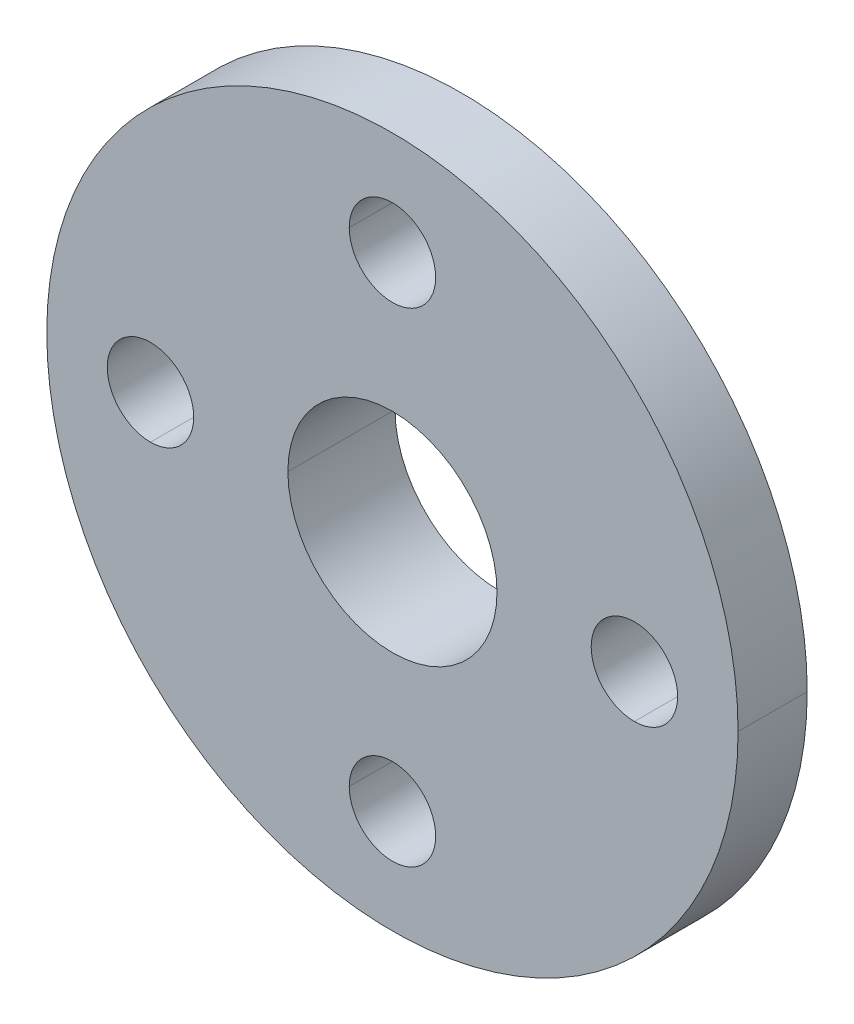
ISO-10303-21;
HEADER;
FILE_DESCRIPTION(('STEP AP214'),'2;1');
FILE_NAME('part.step','',(''),(''),'','','');
FILE_SCHEMA(('AUTOMOTIVE_DESIGN { 1 0 10303 214 1 1 1 1 }'));
ENDSEC;
DATA;
#1=APPLICATION_CONTEXT('core data for automotive mechanical design processes');
#2=APPLICATION_PROTOCOL_DEFINITION('international standard','automotive_design',2000,#1);
#3=PRODUCT_CONTEXT('',#1,'mechanical');
#4=PRODUCT('Part','Part','',(#3));
#5=PRODUCT_RELATED_PRODUCT_CATEGORY('part','',(#4));
#6=PRODUCT_DEFINITION_FORMATION('','',#4);
#7=PRODUCT_DEFINITION_CONTEXT('part definition',#1,'design');
#8=PRODUCT_DEFINITION('design','',#6,#7);
#9=PRODUCT_DEFINITION_SHAPE('','',#8);
#10=(LENGTH_UNIT() NAMED_UNIT(*) SI_UNIT(.MILLI.,.METRE.));
#11=(NAMED_UNIT(*) PLANE_ANGLE_UNIT() SI_UNIT($,.RADIAN.));
#12=(NAMED_UNIT(*) SI_UNIT($,.STERADIAN.) SOLID_ANGLE_UNIT());
#13=UNCERTAINTY_MEASURE_WITH_UNIT(LENGTH_MEASURE(1.E-05),#10,'distance_accuracy_value','');
#14=(GEOMETRIC_REPRESENTATION_CONTEXT(3) GLOBAL_UNCERTAINTY_ASSIGNED_CONTEXT((#13)) GLOBAL_UNIT_ASSIGNED_CONTEXT((#10,
#11,#12)) REPRESENTATION_CONTEXT('',''));
#15=CARTESIAN_POINT('',(0.,0.,0.));
#16=DIRECTION('',(0.,0.,1.));
#17=DIRECTION('',(1.,0.,0.));
#18=AXIS2_PLACEMENT_3D('',#15,#16,#17);
#19=CARTESIAN_POINT('',(-46.10264464667,-19.8999981269,11.476));
#20=DIRECTION('',(0.,0.,1.));
#21=DIRECTION('',(0.,1.,0.));
#22=AXIS2_PLACEMENT_3D('',#19,#20,#21);
#23=CYLINDRICAL_SURFACE('',#22,1.25);
#24=DIRECTION('',(0.,0.,1.));
#25=VECTOR('',#24,1.);
#26=CARTESIAN_POINT('',(-46.10264464667,-18.6499981269,9.476));
#27=LINE('',#26,#25);
#28=CARTESIAN_POINT('',(-46.10264464667,-18.6499981269,9.476));
#29=VERTEX_POINT('',#28);
#30=CARTESIAN_POINT('',(-46.10264464667,-18.6499981269,11.476));
#31=VERTEX_POINT('',#30);
#32=EDGE_CURVE('E11',#29,#31,#27,.T.);
#33=ORIENTED_EDGE('',*,*,#32,.F.);
#34=CARTESIAN_POINT('',(-46.10264464667,-19.8999981269,9.476));
#35=DIRECTION('',(0.,0.,-1.));
#36=DIRECTION('',(0.,1.,0.));
#37=AXIS2_PLACEMENT_3D('',#34,#35,#36);
#38=CIRCLE('',#37,1.25);
#39=CARTESIAN_POINT('',(-46.10264464667,-21.1499981269,9.476));
#40=VERTEX_POINT('',#39);
#41=EDGE_CURVE('E217',#29,#40,#38,.T.);
#42=ORIENTED_EDGE('',*,*,#41,.T.);
#43=DIRECTION('',(0.,0.,1.));
#44=VECTOR('',#43,1.);
#45=CARTESIAN_POINT('',(-46.10264464667,-21.1499981269,9.476));
#46=LINE('',#45,#44);
#47=CARTESIAN_POINT('',(-46.10264464667,-21.1499981269,11.476));
#48=VERTEX_POINT('',#47);
#49=EDGE_CURVE('E27',#40,#48,#46,.T.);
#50=ORIENTED_EDGE('',*,*,#49,.T.);
#51=CARTESIAN_POINT('',(-46.10264464667,-19.8999981269,11.476));
#52=DIRECTION('',(0.,0.,1.));
#53=DIRECTION('',(0.,-1.,0.));
#54=AXIS2_PLACEMENT_3D('',#51,#52,#53);
#55=CIRCLE('',#54,1.25);
#56=EDGE_CURVE('E180',#48,#31,#55,.T.);
#57=ORIENTED_EDGE('',*,*,#56,.T.);
#58=EDGE_LOOP('',(#33,#42,#50,#57));
#59=FACE_BOUND('',#58,.T.);
#60=ADVANCED_FACE('F16',(#59),#23,.F.);
#61=CARTESIAN_POINT('',(-46.10264464667,-19.8999981269,11.476));
#62=DIRECTION('',(0.,0.,1.));
#63=DIRECTION('',(0.,1.,0.));
#64=AXIS2_PLACEMENT_3D('',#61,#62,#63);
#65=CYLINDRICAL_SURFACE('',#64,1.25);
#66=ORIENTED_EDGE('',*,*,#49,.F.);
#67=CARTESIAN_POINT('',(-46.10264464667,-19.8999981269,9.476));
#68=DIRECTION('',(0.,0.,-1.));
#69=DIRECTION('',(0.,-1.,0.));
#70=AXIS2_PLACEMENT_3D('',#67,#68,#69);
#71=CIRCLE('',#70,1.25);
#72=EDGE_CURVE('E203',#40,#29,#71,.T.);
#73=ORIENTED_EDGE('',*,*,#72,.T.);
#74=ORIENTED_EDGE('',*,*,#32,.T.);
#75=CARTESIAN_POINT('',(-46.10264464667,-19.8999981269,11.476));
#76=DIRECTION('',(0.,0.,1.));
#77=DIRECTION('',(0.,1.,0.));
#78=AXIS2_PLACEMENT_3D('',#75,#76,#77);
#79=CIRCLE('',#78,1.25);
#80=EDGE_CURVE('E249',#31,#48,#79,.T.);
#81=ORIENTED_EDGE('',*,*,#80,.T.);
#82=EDGE_LOOP('',(#66,#73,#74,#81));
#83=FACE_BOUND('',#82,.T.);
#84=ADVANCED_FACE('F343',(#83),#65,.F.);
#85=CARTESIAN_POINT('',(-39.10264651977,-26.8999962538,11.476));
#86=DIRECTION('',(0.,0.,1.));
#87=DIRECTION('',(-1.,0.,0.));
#88=AXIS2_PLACEMENT_3D('',#85,#86,#87);
#89=CYLINDRICAL_SURFACE('',#88,1.25);
#90=DIRECTION('',(0.,0.,1.));
#91=VECTOR('',#90,1.);
#92=CARTESIAN_POINT('',(-40.35264651977,-26.8999962538,9.476));
#93=LINE('',#92,#91);
#94=CARTESIAN_POINT('',(-40.35264651977,-26.8999962538,9.476));
#95=VERTEX_POINT('',#94);
#96=CARTESIAN_POINT('',(-40.35264651977,-26.8999962538,11.476));
#97=VERTEX_POINT('',#96);
#98=EDGE_CURVE('E195',#95,#97,#93,.T.);
#99=ORIENTED_EDGE('',*,*,#98,.F.);
#100=CARTESIAN_POINT('',(-39.10264651977,-26.8999962538,9.476));
#101=DIRECTION('',(0.,0.,-1.));
#102=DIRECTION('',(-1.,0.,0.));
#103=AXIS2_PLACEMENT_3D('',#100,#101,#102);
#104=CIRCLE('',#103,1.25);
#105=CARTESIAN_POINT('',(-37.85264651977,-26.8999962538,9.476));
#106=VERTEX_POINT('',#105);
#107=EDGE_CURVE('E225',#95,#106,#104,.T.);
#108=ORIENTED_EDGE('',*,*,#107,.T.);
#109=DIRECTION('',(0.,0.,1.));
#110=VECTOR('',#109,1.);
#111=CARTESIAN_POINT('',(-37.85264651977,-26.8999962538,9.476));
#112=LINE('',#111,#110);
#113=CARTESIAN_POINT('',(-37.85264651977,-26.8999962538,11.476));
#114=VERTEX_POINT('',#113);
#115=EDGE_CURVE('E283',#106,#114,#112,.T.);
#116=ORIENTED_EDGE('',*,*,#115,.T.);
#117=CARTESIAN_POINT('',(-39.10264651977,-26.8999962538,11.476));
#118=DIRECTION('',(0.,0.,1.));
#119=DIRECTION('',(1.,0.,0.));
#120=AXIS2_PLACEMENT_3D('',#117,#118,#119);
#121=CIRCLE('',#120,1.25);
#122=EDGE_CURVE('E253',#114,#97,#121,.T.);
#123=ORIENTED_EDGE('',*,*,#122,.T.);
#124=EDGE_LOOP('',(#99,#108,#116,#123));
#125=FACE_BOUND('',#124,.T.);
#126=ADVANCED_FACE('F349',(#125),#89,.F.);
#127=CARTESIAN_POINT('',(-39.10264651977,-26.8999962538,11.476));
#128=DIRECTION('',(0.,0.,1.));
#129=DIRECTION('',(-1.,0.,0.));
#130=AXIS2_PLACEMENT_3D('',#127,#128,#129);
#131=CYLINDRICAL_SURFACE('',#130,1.25);
#132=ORIENTED_EDGE('',*,*,#115,.F.);
#133=CARTESIAN_POINT('',(-39.10264651977,-26.8999962538,9.476));
#134=DIRECTION('',(0.,0.,-1.));
#135=DIRECTION('',(1.,0.,0.));
#136=AXIS2_PLACEMENT_3D('',#133,#134,#135);
#137=CIRCLE('',#136,1.25);
#138=EDGE_CURVE('E221',#106,#95,#137,.T.);
#139=ORIENTED_EDGE('',*,*,#138,.T.);
#140=ORIENTED_EDGE('',*,*,#98,.T.);
#141=CARTESIAN_POINT('',(-39.10264651977,-26.8999962538,11.476));
#142=DIRECTION('',(0.,0.,1.));
#143=DIRECTION('',(-1.,0.,0.));
#144=AXIS2_PLACEMENT_3D('',#141,#142,#143);
#145=CIRCLE('',#144,1.25);
#146=EDGE_CURVE('E267',#97,#114,#145,.T.);
#147=ORIENTED_EDGE('',*,*,#146,.T.);
#148=EDGE_LOOP('',(#132,#139,#140,#147));
#149=FACE_BOUND('',#148,.T.);
#150=ADVANCED_FACE('F368',(#149),#131,.F.);
#151=CARTESIAN_POINT('',(-32.10264839287,-19.8999981269,11.476));
#152=DIRECTION('',(0.,0.,1.));
#153=DIRECTION('',(0.,-1.,0.));
#154=AXIS2_PLACEMENT_3D('',#151,#152,#153);
#155=CYLINDRICAL_SURFACE('',#154,1.25);
#156=DIRECTION('',(0.,0.,1.));
#157=VECTOR('',#156,1.);
#158=CARTESIAN_POINT('',(-32.10264839287,-21.1499981269,9.476));
#159=LINE('',#158,#157);
#160=CARTESIAN_POINT('',(-32.10264839287,-21.1499981269,9.476));
#161=VERTEX_POINT('',#160);
#162=CARTESIAN_POINT('',(-32.10264839287,-21.1499981269,11.476));
#163=VERTEX_POINT('',#162);
#164=EDGE_CURVE('E278',#161,#163,#159,.T.);
#165=ORIENTED_EDGE('',*,*,#164,.F.);
#166=CARTESIAN_POINT('',(-32.10264839287,-19.8999981269,9.476));
#167=DIRECTION('',(0.,0.,-1.));
#168=DIRECTION('',(0.,-1.,0.));
#169=AXIS2_PLACEMENT_3D('',#166,#167,#168);
#170=CIRCLE('',#169,1.25);
#171=CARTESIAN_POINT('',(-32.10264839287,-18.6499981269,9.476));
#172=VERTEX_POINT('',#171);
#173=EDGE_CURVE('E199',#161,#172,#170,.T.);
#174=ORIENTED_EDGE('',*,*,#173,.T.);
#175=DIRECTION('',(0.,0.,1.));
#176=VECTOR('',#175,1.);
#177=CARTESIAN_POINT('',(-32.10264839287,-18.6499981269,9.476));
#178=LINE('',#177,#176);
#179=CARTESIAN_POINT('',(-32.10264839287,-18.6499981269,11.476));
#180=VERTEX_POINT('',#179);
#181=EDGE_CURVE('E228',#172,#180,#178,.T.);
#182=ORIENTED_EDGE('',*,*,#181,.T.);
#183=CARTESIAN_POINT('',(-32.10264839287,-19.8999981269,11.476));
#184=DIRECTION('',(0.,0.,1.));
#185=DIRECTION('',(0.,1.,0.));
#186=AXIS2_PLACEMENT_3D('',#183,#184,#185);
#187=CIRCLE('',#186,1.25);
#188=EDGE_CURVE('E212',#180,#163,#187,.T.);
#189=ORIENTED_EDGE('',*,*,#188,.T.);
#190=EDGE_LOOP('',(#165,#174,#182,#189));
#191=FACE_BOUND('',#190,.T.);
#192=ADVANCED_FACE('F304',(#191),#155,.F.);
#193=CARTESIAN_POINT('',(-32.10264839287,-19.8999981269,11.476));
#194=DIRECTION('',(0.,0.,1.));
#195=DIRECTION('',(0.,-1.,0.));
#196=AXIS2_PLACEMENT_3D('',#193,#194,#195);
#197=CYLINDRICAL_SURFACE('',#196,1.25);
#198=ORIENTED_EDGE('',*,*,#181,.F.);
#199=CARTESIAN_POINT('',(-32.10264839287,-19.8999981269,9.476));
#200=DIRECTION('',(0.,0.,-1.));
#201=DIRECTION('',(0.,1.,0.));
#202=AXIS2_PLACEMENT_3D('',#199,#200,#201);
#203=CIRCLE('',#202,1.25);
#204=EDGE_CURVE('E233',#172,#161,#203,.T.);
#205=ORIENTED_EDGE('',*,*,#204,.T.);
#206=ORIENTED_EDGE('',*,*,#164,.T.);
#207=CARTESIAN_POINT('',(-32.10264839287,-19.8999981269,11.476));
#208=DIRECTION('',(0.,0.,1.));
#209=DIRECTION('',(0.,-1.,0.));
#210=AXIS2_PLACEMENT_3D('',#207,#208,#209);
#211=CIRCLE('',#210,1.25);
#212=EDGE_CURVE('E208',#163,#180,#211,.T.);
#213=ORIENTED_EDGE('',*,*,#212,.T.);
#214=EDGE_LOOP('',(#198,#205,#206,#213));
#215=FACE_BOUND('',#214,.T.);
#216=ADVANCED_FACE('F298',(#215),#197,.F.);
#217=CARTESIAN_POINT('',(-39.10264651977,-12.9,11.476));
#218=DIRECTION('',(0.,0.,1.));
#219=DIRECTION('',(1.,0.,0.));
#220=AXIS2_PLACEMENT_3D('',#217,#218,#219);
#221=CYLINDRICAL_SURFACE('',#220,1.25);
#222=DIRECTION('',(0.,0.,1.));
#223=VECTOR('',#222,1.);
#224=CARTESIAN_POINT('',(-37.85264651977,-12.9,9.476));
#225=LINE('',#224,#223);
#226=CARTESIAN_POINT('',(-37.85264651977,-12.9,9.476));
#227=VERTEX_POINT('',#226);
#228=CARTESIAN_POINT('',(-37.85264651977,-12.9,11.476));
#229=VERTEX_POINT('',#228);
#230=EDGE_CURVE('E93',#227,#229,#225,.T.);
#231=ORIENTED_EDGE('',*,*,#230,.F.);
#232=CARTESIAN_POINT('',(-39.10264651977,-12.9,9.476));
#233=DIRECTION('',(0.,0.,-1.));
#234=DIRECTION('',(1.,0.,0.));
#235=AXIS2_PLACEMENT_3D('',#232,#233,#234);
#236=CIRCLE('',#235,1.25);
#237=CARTESIAN_POINT('',(-40.35264651977,-12.9,9.476));
#238=VERTEX_POINT('',#237);
#239=EDGE_CURVE('E200',#227,#238,#236,.T.);
#240=ORIENTED_EDGE('',*,*,#239,.T.);
#241=DIRECTION('',(0.,0.,1.));
#242=VECTOR('',#241,1.);
#243=CARTESIAN_POINT('',(-40.35264651977,-12.9,9.476));
#244=LINE('',#243,#242);
#245=CARTESIAN_POINT('',(-40.35264651977,-12.9,11.476));
#246=VERTEX_POINT('',#245);
#247=EDGE_CURVE('E229',#238,#246,#244,.T.);
#248=ORIENTED_EDGE('',*,*,#247,.T.);
#249=CARTESIAN_POINT('',(-39.10264651977,-12.9,11.476));
#250=DIRECTION('',(0.,0.,1.));
#251=DIRECTION('',(-1.,0.,0.));
#252=AXIS2_PLACEMENT_3D('',#249,#250,#251);
#253=CIRCLE('',#252,1.25);
#254=EDGE_CURVE('E211',#246,#229,#253,.T.);
#255=ORIENTED_EDGE('',*,*,#254,.T.);
#256=EDGE_LOOP('',(#231,#240,#248,#255));
#257=FACE_BOUND('',#256,.T.);
#258=ADVANCED_FACE('F362',(#257),#221,.F.);
#259=CARTESIAN_POINT('',(-39.10264651977,-12.9,11.476));
#260=DIRECTION('',(0.,0.,1.));
#261=DIRECTION('',(1.,0.,0.));
#262=AXIS2_PLACEMENT_3D('',#259,#260,#261);
#263=CYLINDRICAL_SURFACE('',#262,1.25);
#264=ORIENTED_EDGE('',*,*,#247,.F.);
#265=CARTESIAN_POINT('',(-39.10264651977,-12.9,9.476));
#266=DIRECTION('',(0.,0.,-1.));
#267=DIRECTION('',(-1.,0.,0.));
#268=AXIS2_PLACEMENT_3D('',#265,#266,#267);
#269=CIRCLE('',#268,1.25);
#270=EDGE_CURVE('E197',#238,#227,#269,.T.);
#271=ORIENTED_EDGE('',*,*,#270,.T.);
#272=ORIENTED_EDGE('',*,*,#230,.T.);
#273=CARTESIAN_POINT('',(-39.10264651977,-12.9,11.476));
#274=DIRECTION('',(0.,0.,1.));
#275=DIRECTION('',(1.,0.,0.));
#276=AXIS2_PLACEMENT_3D('',#273,#274,#275);
#277=CIRCLE('',#276,1.25);
#278=EDGE_CURVE('E234',#229,#246,#277,.T.);
#279=ORIENTED_EDGE('',*,*,#278,.T.);
#280=EDGE_LOOP('',(#264,#271,#272,#279));
#281=FACE_BOUND('',#280,.T.);
#282=ADVANCED_FACE('F18',(#281),#263,.F.);
#283=CARTESIAN_POINT('',(-39.10264651977,-19.8999981269,12.426));
#284=DIRECTION('',(0.,0.,1.));
#285=DIRECTION('',(1.,0.,0.));
#286=AXIS2_PLACEMENT_3D('',#283,#284,#285);
#287=CYLINDRICAL_SURFACE('',#286,3.025);
#288=DIRECTION('',(0.,0.,1.));
#289=VECTOR('',#288,1.);
#290=CARTESIAN_POINT('',(-36.07764651977,-19.8999981269,8.376));
#291=LINE('',#290,#289);
#292=CARTESIAN_POINT('',(-36.07764651977,-19.8999981269,8.376));
#293=VERTEX_POINT('',#292);
#294=CARTESIAN_POINT('',(-36.07764651977,-19.8999981269,11.476));
#295=VERTEX_POINT('',#294);
#296=EDGE_CURVE('E191',#293,#295,#291,.T.);
#297=ORIENTED_EDGE('',*,*,#296,.F.);
#298=CARTESIAN_POINT('',(-39.10264651977,-19.8999981269,8.376));
#299=DIRECTION('',(0.,0.,-1.));
#300=DIRECTION('',(1.,0.,0.));
#301=AXIS2_PLACEMENT_3D('',#298,#299,#300);
#302=CIRCLE('',#301,3.025);
#303=CARTESIAN_POINT('',(-42.12764651977,-19.8999981269,8.376));
#304=VERTEX_POINT('',#303);
#305=EDGE_CURVE('E206',#293,#304,#302,.T.);
#306=ORIENTED_EDGE('',*,*,#305,.T.);
#307=DIRECTION('',(0.,0.,1.));
#308=VECTOR('',#307,1.);
#309=CARTESIAN_POINT('',(-42.12764651977,-19.8999981269,8.376));
#310=LINE('',#309,#308);
#311=CARTESIAN_POINT('',(-42.12764651977,-19.8999981269,11.476));
#312=VERTEX_POINT('',#311);
#313=EDGE_CURVE('E244',#304,#312,#310,.T.);
#314=ORIENTED_EDGE('',*,*,#313,.T.);
#315=CARTESIAN_POINT('',(-39.10264651977,-19.8999981269,11.476));
#316=DIRECTION('',(0.,0.,1.));
#317=DIRECTION('',(-1.,0.,0.));
#318=AXIS2_PLACEMENT_3D('',#315,#316,#317);
#319=CIRCLE('',#318,3.025);
#320=EDGE_CURVE('E238',#312,#295,#319,.T.);
#321=ORIENTED_EDGE('',*,*,#320,.T.);
#322=EDGE_LOOP('',(#297,#306,#314,#321));
#323=FACE_BOUND('',#322,.T.);
#324=ADVANCED_FACE('F374',(#323),#287,.F.);
#325=CARTESIAN_POINT('',(-39.10264651977,-19.8999981269,6.716));
#326=DIRECTION('',(0.,0.,-1.));
#327=DIRECTION('',(1.,0.,0.));
#328=AXIS2_PLACEMENT_3D('',#325,#326,#327);
#329=CYLINDRICAL_SURFACE('',#328,4.5);
#330=DIRECTION('',(0.,0.,-1.));
#331=VECTOR('',#330,1.);
#332=CARTESIAN_POINT('',(-34.60264651977,-19.8999981269,9.476));
#333=LINE('',#332,#331);
#334=CARTESIAN_POINT('',(-34.60264651977,-19.8999981269,9.476));
#335=VERTEX_POINT('',#334);
#336=CARTESIAN_POINT('',(-34.60264651977,-19.8999981269,8.376));
#337=VERTEX_POINT('',#336);
#338=EDGE_CURVE('E110',#335,#337,#333,.T.);
#339=ORIENTED_EDGE('',*,*,#338,.F.);
#340=CARTESIAN_POINT('',(-39.10264651977,-19.8999981269,9.476));
#341=DIRECTION('',(0.,0.,-1.));
#342=DIRECTION('',(1.,0.,0.));
#343=AXIS2_PLACEMENT_3D('',#340,#341,#342);
#344=CIRCLE('',#343,4.5);
#345=CARTESIAN_POINT('',(-43.60264651977,-19.8999981269,9.476));
#346=VERTEX_POINT('',#345);
#347=EDGE_CURVE('E254',#335,#346,#344,.T.);
#348=ORIENTED_EDGE('',*,*,#347,.T.);
#349=DIRECTION('',(0.,0.,-1.));
#350=VECTOR('',#349,1.);
#351=CARTESIAN_POINT('',(-43.60264651977,-19.8999981269,9.476));
#352=LINE('',#351,#350);
#353=CARTESIAN_POINT('',(-43.60264651977,-19.8999981269,8.376));
#354=VERTEX_POINT('',#353);
#355=EDGE_CURVE('E101',#346,#354,#352,.T.);
#356=ORIENTED_EDGE('',*,*,#355,.T.);
#357=CARTESIAN_POINT('',(-39.10264651977,-19.8999981269,8.376));
#358=DIRECTION('',(0.,0.,1.));
#359=DIRECTION('',(-1.,0.,0.));
#360=AXIS2_PLACEMENT_3D('',#357,#358,#359);
#361=CIRCLE('',#360,4.5);
#362=EDGE_CURVE('E41',#354,#337,#361,.T.);
#363=ORIENTED_EDGE('',*,*,#362,.T.);
#364=EDGE_LOOP('',(#339,#348,#356,#363));
#365=FACE_BOUND('',#364,.T.);
#366=ADVANCED_FACE('F324',(#365),#329,.T.);
#367=CARTESIAN_POINT('',(-28.10437565297,-19.9,8.376));
#368=DIRECTION('',(0.,0.,1.));
#369=DIRECTION('',(1.,0.,0.));
#370=AXIS2_PLACEMENT_3D('',#367,#368,#369);
#371=PLANE('',#370);
#372=ORIENTED_EDGE('',*,*,#305,.F.);
#373=CARTESIAN_POINT('',(-39.10264651977,-19.8999981269,8.376));
#374=DIRECTION('',(0.,0.,-1.));
#375=DIRECTION('',(-1.,0.,0.));
#376=AXIS2_PLACEMENT_3D('',#373,#374,#375);
#377=CIRCLE('',#376,3.025);
#378=EDGE_CURVE('E248',#304,#293,#377,.T.);
#379=ORIENTED_EDGE('',*,*,#378,.F.);
#380=EDGE_LOOP('',(#372,#379));
#381=FACE_BOUND('',#380,.T.);
#382=ORIENTED_EDGE('',*,*,#362,.F.);
#383=CARTESIAN_POINT('',(-39.10264651977,-19.8999981269,8.376));
#384=DIRECTION('',(0.,0.,1.));
#385=DIRECTION('',(1.,0.,0.));
#386=AXIS2_PLACEMENT_3D('',#383,#384,#385);
#387=CIRCLE('',#386,4.5);
#388=EDGE_CURVE('E207',#337,#354,#387,.T.);
#389=ORIENTED_EDGE('',*,*,#388,.F.);
#390=EDGE_LOOP('',(#382,#389));
#391=FACE_BOUND('',#390,.T.);
#392=ADVANCED_FACE('F337',(#381,#391),#371,.F.);
#393=CARTESIAN_POINT('',(-39.10264651977,-19.8999981269,6.716));
#394=DIRECTION('',(0.,0.,-1.));
#395=DIRECTION('',(1.,0.,0.));
#396=AXIS2_PLACEMENT_3D('',#393,#394,#395);
#397=CYLINDRICAL_SURFACE('',#396,4.5);
#398=ORIENTED_EDGE('',*,*,#355,.F.);
#399=CARTESIAN_POINT('',(-39.10264651977,-19.8999981269,9.476));
#400=DIRECTION('',(0.,0.,-1.));
#401=DIRECTION('',(-1.,0.,0.));
#402=AXIS2_PLACEMENT_3D('',#399,#400,#401);
#403=CIRCLE('',#402,4.5);
#404=EDGE_CURVE('E220',#346,#335,#403,.T.);
#405=ORIENTED_EDGE('',*,*,#404,.T.);
#406=ORIENTED_EDGE('',*,*,#338,.T.);
#407=ORIENTED_EDGE('',*,*,#388,.T.);
#408=EDGE_LOOP('',(#398,#405,#406,#407));
#409=FACE_BOUND('',#408,.T.);
#410=ADVANCED_FACE('F322',(#409),#397,.T.);
#411=CARTESIAN_POINT('',(-39.10264565297,-19.9,9.476));
#412=DIRECTION('',(0.,0.,-1.));
#413=DIRECTION('',(0.,-1.,0.));
#414=AXIS2_PLACEMENT_3D('',#411,#412,#413);
#415=PLANE('',#414);
#416=ORIENTED_EDGE('',*,*,#41,.F.);
#417=ORIENTED_EDGE('',*,*,#72,.F.);
#418=EDGE_LOOP('',(#416,#417));
#419=FACE_BOUND('',#418,.T.);
#420=ORIENTED_EDGE('',*,*,#107,.F.);
#421=ORIENTED_EDGE('',*,*,#138,.F.);
#422=EDGE_LOOP('',(#420,#421));
#423=FACE_BOUND('',#422,.T.);
#424=ORIENTED_EDGE('',*,*,#173,.F.);
#425=ORIENTED_EDGE('',*,*,#204,.F.);
#426=EDGE_LOOP('',(#424,#425));
#427=FACE_BOUND('',#426,.T.);
#428=ORIENTED_EDGE('',*,*,#239,.F.);
#429=ORIENTED_EDGE('',*,*,#270,.F.);
#430=EDGE_LOOP('',(#428,#429));
#431=FACE_BOUND('',#430,.T.);
#432=ORIENTED_EDGE('',*,*,#347,.F.);
#433=ORIENTED_EDGE('',*,*,#404,.F.);
#434=EDGE_LOOP('',(#432,#433));
#435=FACE_BOUND('',#434,.T.);
#436=CARTESIAN_POINT('',(-39.10264651977,-19.8999981269,9.476));
#437=DIRECTION('',(0.,0.,1.));
#438=DIRECTION('',(1.,0.,0.));
#439=AXIS2_PLACEMENT_3D('',#436,#437,#438);
#440=CIRCLE('',#439,10.);
#441=CARTESIAN_POINT('',(-29.10264651977,-19.8999981269,9.476));
#442=VERTEX_POINT('',#441);
#443=CARTESIAN_POINT('',(-49.10264651977,-19.8999981269,9.476));
#444=VERTEX_POINT('',#443);
#445=EDGE_CURVE('E174',#442,#444,#440,.T.);
#446=ORIENTED_EDGE('',*,*,#445,.F.);
#447=CARTESIAN_POINT('',(-39.10264651977,-19.8999981269,9.476));
#448=DIRECTION('',(0.,0.,1.));
#449=DIRECTION('',(-1.,0.,0.));
#450=AXIS2_PLACEMENT_3D('',#447,#448,#449);
#451=CIRCLE('',#450,10.);
#452=EDGE_CURVE('E170',#444,#442,#451,.T.);
#453=ORIENTED_EDGE('',*,*,#452,.F.);
#454=EDGE_LOOP('',(#446,#453));
#455=FACE_BOUND('',#454,.T.);
#456=ADVANCED_FACE('F301',(#419,#423,#427,#431,#435,#455),#415,.T.);
#457=CARTESIAN_POINT('',(-39.10264651977,-19.8999981269,11.476));
#458=DIRECTION('',(0.,0.,1.));
#459=DIRECTION('',(1.,0.,0.));
#460=AXIS2_PLACEMENT_3D('',#457,#458,#459);
#461=CYLINDRICAL_SURFACE('',#460,10.);
#462=DIRECTION('',(0.,0.,1.));
#463=VECTOR('',#462,1.);
#464=CARTESIAN_POINT('',(-29.10264651977,-19.8999981269,9.476));
#465=LINE('',#464,#463);
#466=CARTESIAN_POINT('',(-29.10264651977,-19.8999981269,11.476));
#467=VERTEX_POINT('',#466);
#468=EDGE_CURVE('E164',#442,#467,#465,.T.);
#469=ORIENTED_EDGE('',*,*,#468,.F.);
#470=ORIENTED_EDGE('',*,*,#445,.T.);
#471=DIRECTION('',(0.,0.,1.));
#472=VECTOR('',#471,1.);
#473=CARTESIAN_POINT('',(-49.10264651977,-19.8999981269,9.476));
#474=LINE('',#473,#472);
#475=CARTESIAN_POINT('',(-49.10264651977,-19.8999981269,11.476));
#476=VERTEX_POINT('',#475);
#477=EDGE_CURVE('E182',#444,#476,#474,.T.);
#478=ORIENTED_EDGE('',*,*,#477,.T.);
#479=CARTESIAN_POINT('',(-39.10264651977,-19.8999981269,11.476));
#480=DIRECTION('',(0.,0.,-1.));
#481=DIRECTION('',(-1.,0.,0.));
#482=AXIS2_PLACEMENT_3D('',#479,#480,#481);
#483=CIRCLE('',#482,10.);
#484=EDGE_CURVE('E178',#476,#467,#483,.T.);
#485=ORIENTED_EDGE('',*,*,#484,.T.);
#486=EDGE_LOOP('',(#469,#470,#478,#485));
#487=FACE_BOUND('',#486,.T.);
#488=ADVANCED_FACE('F181',(#487),#461,.T.);
#489=CARTESIAN_POINT('',(-39.10264651977,-19.8999981269,11.476));
#490=DIRECTION('',(0.,0.,1.));
#491=DIRECTION('',(1.,0.,0.));
#492=AXIS2_PLACEMENT_3D('',#489,#490,#491);
#493=CYLINDRICAL_SURFACE('',#492,10.);
#494=ORIENTED_EDGE('',*,*,#477,.F.);
#495=ORIENTED_EDGE('',*,*,#452,.T.);
#496=ORIENTED_EDGE('',*,*,#468,.T.);
#497=CARTESIAN_POINT('',(-39.10264651977,-19.8999981269,11.476));
#498=DIRECTION('',(0.,0.,-1.));
#499=DIRECTION('',(1.,0.,0.));
#500=AXIS2_PLACEMENT_3D('',#497,#498,#499);
#501=CIRCLE('',#500,10.);
#502=EDGE_CURVE('E20',#467,#476,#501,.T.);
#503=ORIENTED_EDGE('',*,*,#502,.T.);
#504=EDGE_LOOP('',(#494,#495,#496,#503));
#505=FACE_BOUND('',#504,.T.);
#506=ADVANCED_FACE('F167',(#505),#493,.T.);
#507=CARTESIAN_POINT('',(-28.10437565297,-19.9,11.476));
#508=DIRECTION('',(0.,0.,-1.));
#509=DIRECTION('',(0.,-1.,0.));
#510=AXIS2_PLACEMENT_3D('',#507,#508,#509);
#511=PLANE('',#510);
#512=ORIENTED_EDGE('',*,*,#320,.F.);
#513=CARTESIAN_POINT('',(-39.10264651977,-19.8999981269,11.476));
#514=DIRECTION('',(0.,0.,1.));
#515=DIRECTION('',(1.,0.,0.));
#516=AXIS2_PLACEMENT_3D('',#513,#514,#515);
#517=CIRCLE('',#516,3.025);
#518=EDGE_CURVE('E184',#295,#312,#517,.T.);
#519=ORIENTED_EDGE('',*,*,#518,.F.);
#520=EDGE_LOOP('',(#512,#519));
#521=FACE_BOUND('',#520,.T.);
#522=ORIENTED_EDGE('',*,*,#254,.F.);
#523=ORIENTED_EDGE('',*,*,#278,.F.);
#524=EDGE_LOOP('',(#522,#523));
#525=FACE_BOUND('',#524,.T.);
#526=ORIENTED_EDGE('',*,*,#188,.F.);
#527=ORIENTED_EDGE('',*,*,#212,.F.);
#528=EDGE_LOOP('',(#526,#527));
#529=FACE_BOUND('',#528,.T.);
#530=ORIENTED_EDGE('',*,*,#122,.F.);
#531=ORIENTED_EDGE('',*,*,#146,.F.);
#532=EDGE_LOOP('',(#530,#531));
#533=FACE_BOUND('',#532,.T.);
#534=ORIENTED_EDGE('',*,*,#56,.F.);
#535=ORIENTED_EDGE('',*,*,#80,.F.);
#536=EDGE_LOOP('',(#534,#535));
#537=FACE_BOUND('',#536,.T.);
#538=ORIENTED_EDGE('',*,*,#484,.F.);
#539=ORIENTED_EDGE('',*,*,#502,.F.);
#540=EDGE_LOOP('',(#538,#539));
#541=FACE_BOUND('',#540,.T.);
#542=ADVANCED_FACE('F177',(#521,#525,#529,#533,#537,#541),#511,.F.);
#543=CARTESIAN_POINT('',(-39.10264651977,-19.8999981269,12.426));
#544=DIRECTION('',(0.,0.,1.));
#545=DIRECTION('',(1.,0.,0.));
#546=AXIS2_PLACEMENT_3D('',#543,#544,#545);
#547=CYLINDRICAL_SURFACE('',#546,3.025);
#548=ORIENTED_EDGE('',*,*,#313,.F.);
#549=ORIENTED_EDGE('',*,*,#378,.T.);
#550=ORIENTED_EDGE('',*,*,#296,.T.);
#551=ORIENTED_EDGE('',*,*,#518,.T.);
#552=EDGE_LOOP('',(#548,#549,#550,#551));
#553=FACE_BOUND('',#552,.T.);
#554=ADVANCED_FACE('F357',(#553),#547,.F.);
#555=CLOSED_SHELL('',(#60,#84,#126,#150,#192,#216,#258,#282,#324,#366,#392,#410,#456,#488,#506,
#542,#554));
#556=MANIFOLD_SOLID_BREP('B1',#555);
#557=ADVANCED_BREP_SHAPE_REPRESENTATION('',(#18,#556),#14);
#558=SHAPE_DEFINITION_REPRESENTATION(#9,#557);
ENDSEC;
END-ISO-10303-21;
